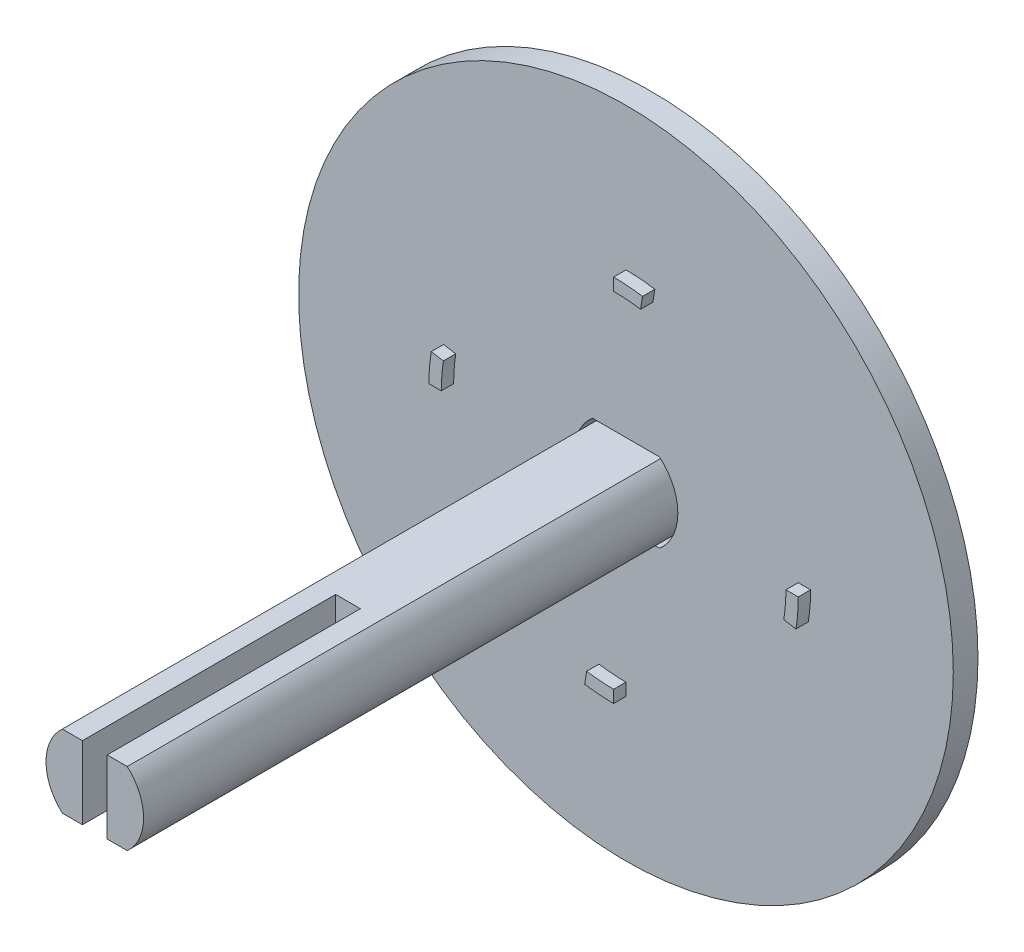
ISO-10303-21;
HEADER;
FILE_DESCRIPTION(('STEP AP214'),'2;1');
FILE_NAME('part.step','',(''),(''),'','','');
FILE_SCHEMA(('AUTOMOTIVE_DESIGN { 1 0 10303 214 1 1 1 1 }'));
ENDSEC;
DATA;
#1=APPLICATION_CONTEXT('core data for automotive mechanical design processes');
#2=APPLICATION_PROTOCOL_DEFINITION('international standard','automotive_design',2000,#1);
#3=PRODUCT_CONTEXT('',#1,'mechanical');
#4=PRODUCT('Part','Part','',(#3));
#5=PRODUCT_RELATED_PRODUCT_CATEGORY('part','',(#4));
#6=PRODUCT_DEFINITION_FORMATION('','',#4);
#7=PRODUCT_DEFINITION_CONTEXT('part definition',#1,'design');
#8=PRODUCT_DEFINITION('design','',#6,#7);
#9=PRODUCT_DEFINITION_SHAPE('','',#8);
#10=(LENGTH_UNIT() NAMED_UNIT(*) SI_UNIT(.MILLI.,.METRE.));
#11=(NAMED_UNIT(*) PLANE_ANGLE_UNIT() SI_UNIT($,.RADIAN.));
#12=(NAMED_UNIT(*) SI_UNIT($,.STERADIAN.) SOLID_ANGLE_UNIT());
#13=UNCERTAINTY_MEASURE_WITH_UNIT(LENGTH_MEASURE(1.E-05),#10,'distance_accuracy_value','');
#14=(GEOMETRIC_REPRESENTATION_CONTEXT(3) GLOBAL_UNCERTAINTY_ASSIGNED_CONTEXT((#13)) GLOBAL_UNIT_ASSIGNED_CONTEXT((#10,
#11,#12)) REPRESENTATION_CONTEXT('',''));
#15=CARTESIAN_POINT('',(0.,0.,0.));
#16=DIRECTION('',(0.,0.,1.));
#17=DIRECTION('',(1.,0.,0.));
#18=AXIS2_PLACEMENT_3D('',#15,#16,#17);
#19=CARTESIAN_POINT('',(0.,0.,45.));
#20=DIRECTION('',(0.,0.,1.));
#21=DIRECTION('',(1.,0.,0.));
#22=AXIS2_PLACEMENT_3D('',#19,#20,#21);
#23=PLANE('',#22);
#24=DIRECTION('',(0.,1.,0.));
#25=VECTOR('',#24,1.);
#26=CARTESIAN_POINT('',(-1.,-2.95,45.));
#27=LINE('',#26,#25);
#28=CARTESIAN_POINT('',(-1.,-2.95,45.));
#29=VERTEX_POINT('',#28);
#30=CARTESIAN_POINT('',(-1.,2.95,45.));
#31=VERTEX_POINT('',#30);
#32=EDGE_CURVE('E140',#29,#31,#27,.T.);
#33=ORIENTED_EDGE('',*,*,#32,.T.);
#34=DIRECTION('',(-1.,0.,0.));
#35=VECTOR('',#34,1.);
#36=CARTESIAN_POINT('',(-2.62678510731274,2.95,45.));
#37=LINE('',#36,#35);
#38=CARTESIAN_POINT('',(-2.62678510731274,2.95,45.));
#39=VERTEX_POINT('',#38);
#40=EDGE_CURVE('E154',#31,#39,#37,.T.);
#41=ORIENTED_EDGE('',*,*,#40,.T.);
#42=CARTESIAN_POINT('',(0.,0.,45.));
#43=DIRECTION('',(0.,0.,1.));
#44=DIRECTION('',(1.,0.,0.));
#45=AXIS2_PLACEMENT_3D('',#42,#43,#44);
#46=CIRCLE('',#45,3.95);
#47=CARTESIAN_POINT('',(-2.62678510731274,-2.95,45.));
#48=VERTEX_POINT('',#47);
#49=EDGE_CURVE('E143',#39,#48,#46,.T.);
#50=ORIENTED_EDGE('',*,*,#49,.T.);
#51=DIRECTION('',(1.,0.,0.));
#52=VECTOR('',#51,1.);
#53=CARTESIAN_POINT('',(-2.62678510731274,-2.95,45.));
#54=LINE('',#53,#52);
#55=EDGE_CURVE('E148',#48,#29,#54,.T.);
#56=ORIENTED_EDGE('',*,*,#55,.T.);
#57=EDGE_LOOP('',(#33,#41,#50,#56));
#58=FACE_BOUND('',#57,.T.);
#59=ADVANCED_FACE('F44',(#58),#23,.T.);
#60=CARTESIAN_POINT('',(0.,0.,0.));
#61=DIRECTION('',(0.,0.,1.));
#62=DIRECTION('',(1.,0.,0.));
#63=AXIS2_PLACEMENT_3D('',#60,#61,#62);
#64=CYLINDRICAL_SURFACE('',#63,3.95);
#65=DIRECTION('',(0.,0.,1.));
#66=VECTOR('',#65,1.);
#67=CARTESIAN_POINT('',(-2.62678510731274,-2.95,0.));
#68=LINE('',#67,#66);
#69=CARTESIAN_POINT('',(-2.62678510731274,-2.95,0.));
#70=VERTEX_POINT('',#69);
#71=EDGE_CURVE('E48',#70,#48,#68,.T.);
#72=ORIENTED_EDGE('',*,*,#71,.T.);
#73=ORIENTED_EDGE('',*,*,#49,.F.);
#74=DIRECTION('',(0.,0.,1.));
#75=VECTOR('',#74,1.);
#76=CARTESIAN_POINT('',(-2.62678510731274,2.95,0.));
#77=LINE('',#76,#75);
#78=CARTESIAN_POINT('',(-2.62678510731274,2.95,0.));
#79=VERTEX_POINT('',#78);
#80=EDGE_CURVE('E12',#79,#39,#77,.T.);
#81=ORIENTED_EDGE('',*,*,#80,.F.);
#82=CARTESIAN_POINT('',(0.,0.,0.));
#83=DIRECTION('',(0.,0.,1.));
#84=DIRECTION('',(1.,0.,0.));
#85=AXIS2_PLACEMENT_3D('',#82,#83,#84);
#86=CIRCLE('',#85,3.95);
#87=EDGE_CURVE('E158',#79,#70,#86,.T.);
#88=ORIENTED_EDGE('',*,*,#87,.T.);
#89=EDGE_LOOP('',(#72,#73,#81,#88));
#90=FACE_BOUND('',#89,.T.);
#91=ADVANCED_FACE('F46',(#90),#64,.T.);
#92=CARTESIAN_POINT('',(-2.62678510731274,2.95,0.));
#93=DIRECTION('',(0.,1.,0.));
#94=DIRECTION('',(-1.,0.,0.));
#95=AXIS2_PLACEMENT_3D('',#92,#93,#94);
#96=PLANE('',#95);
#97=DIRECTION('',(0.,0.,1.));
#98=VECTOR('',#97,1.);
#99=CARTESIAN_POINT('',(-1.,2.95,24.5));
#100=LINE('',#99,#98);
#101=CARTESIAN_POINT('',(-1.,2.95,24.5));
#102=VERTEX_POINT('',#101);
#103=EDGE_CURVE('E132',#102,#31,#100,.T.);
#104=ORIENTED_EDGE('',*,*,#103,.F.);
#105=DIRECTION('',(-1.,0.,0.));
#106=VECTOR('',#105,1.);
#107=CARTESIAN_POINT('',(-1.,2.95,24.5));
#108=LINE('',#107,#106);
#109=CARTESIAN_POINT('',(0.999999999999997,2.95,24.5));
#110=VERTEX_POINT('',#109);
#111=EDGE_CURVE('E134',#110,#102,#108,.T.);
#112=ORIENTED_EDGE('',*,*,#111,.F.);
#113=DIRECTION('',(0.,0.,-1.));
#114=VECTOR('',#113,1.);
#115=CARTESIAN_POINT('',(1.,2.95,45.));
#116=LINE('',#115,#114);
#117=CARTESIAN_POINT('',(1.,2.95,45.));
#118=VERTEX_POINT('',#117);
#119=EDGE_CURVE('E113',#118,#110,#116,.T.);
#120=ORIENTED_EDGE('',*,*,#119,.F.);
#121=CARTESIAN_POINT('',(2.62678510731274,2.95,45.));
#122=VERTEX_POINT('',#121);
#123=EDGE_CURVE('E155',#122,#118,#37,.T.);
#124=ORIENTED_EDGE('',*,*,#123,.F.);
#125=DIRECTION('',(0.,0.,1.));
#126=VECTOR('',#125,1.);
#127=CARTESIAN_POINT('',(2.62678510731274,2.95,0.));
#128=LINE('',#127,#126);
#129=CARTESIAN_POINT('',(2.62678510731274,2.95,0.));
#130=VERTEX_POINT('',#129);
#131=EDGE_CURVE('E53',#130,#122,#128,.T.);
#132=ORIENTED_EDGE('',*,*,#131,.F.);
#133=DIRECTION('',(-1.,0.,0.));
#134=VECTOR('',#133,1.);
#135=CARTESIAN_POINT('',(-2.62678510731274,2.95,0.));
#136=LINE('',#135,#134);
#137=EDGE_CURVE('E166',#130,#79,#136,.T.);
#138=ORIENTED_EDGE('',*,*,#137,.T.);
#139=ORIENTED_EDGE('',*,*,#80,.T.);
#140=ORIENTED_EDGE('',*,*,#40,.F.);
#141=EDGE_LOOP('',(#104,#112,#120,#124,#132,#138,#139,#140));
#142=FACE_BOUND('',#141,.T.);
#143=ADVANCED_FACE('F177',(#142),#96,.T.);
#144=CARTESIAN_POINT('',(0.,0.,0.));
#145=DIRECTION('',(0.,0.,1.));
#146=DIRECTION('',(1.,0.,0.));
#147=AXIS2_PLACEMENT_3D('',#144,#145,#146);
#148=CYLINDRICAL_SURFACE('',#147,3.95);
#149=ORIENTED_EDGE('',*,*,#131,.T.);
#150=CARTESIAN_POINT('',(0.,0.,45.));
#151=DIRECTION('',(0.,0.,1.));
#152=DIRECTION('',(1.,0.,0.));
#153=AXIS2_PLACEMENT_3D('',#150,#151,#152);
#154=CIRCLE('',#153,3.95);
#155=CARTESIAN_POINT('',(2.62678510731274,-2.95,45.));
#156=VERTEX_POINT('',#155);
#157=EDGE_CURVE('E151',#156,#122,#154,.T.);
#158=ORIENTED_EDGE('',*,*,#157,.F.);
#159=DIRECTION('',(0.,0.,1.));
#160=VECTOR('',#159,1.);
#161=CARTESIAN_POINT('',(2.62678510731274,-2.95,0.));
#162=LINE('',#161,#160);
#163=CARTESIAN_POINT('',(2.62678510731274,-2.95,0.));
#164=VERTEX_POINT('',#163);
#165=EDGE_CURVE('E169',#164,#156,#162,.T.);
#166=ORIENTED_EDGE('',*,*,#165,.F.);
#167=CARTESIAN_POINT('',(0.,0.,0.));
#168=DIRECTION('',(0.,0.,1.));
#169=DIRECTION('',(1.,0.,0.));
#170=AXIS2_PLACEMENT_3D('',#167,#168,#169);
#171=CIRCLE('',#170,3.95);
#172=EDGE_CURVE('E163',#164,#130,#171,.T.);
#173=ORIENTED_EDGE('',*,*,#172,.T.);
#174=EDGE_LOOP('',(#149,#158,#166,#173));
#175=FACE_BOUND('',#174,.T.);
#176=ADVANCED_FACE('F184',(#175),#148,.T.);
#177=CARTESIAN_POINT('',(-2.62678510731274,-2.95,0.));
#178=DIRECTION('',(0.,-1.,0.));
#179=DIRECTION('',(1.,0.,0.));
#180=AXIS2_PLACEMENT_3D('',#177,#178,#179);
#181=PLANE('',#180);
#182=DIRECTION('',(0.,0.,1.));
#183=VECTOR('',#182,1.);
#184=CARTESIAN_POINT('',(-1.,-2.95,24.5));
#185=LINE('',#184,#183);
#186=CARTESIAN_POINT('',(-1.,-2.95,24.5));
#187=VERTEX_POINT('',#186);
#188=EDGE_CURVE('E126',#187,#29,#185,.T.);
#189=ORIENTED_EDGE('',*,*,#188,.T.);
#190=ORIENTED_EDGE('',*,*,#55,.F.);
#191=ORIENTED_EDGE('',*,*,#71,.F.);
#192=DIRECTION('',(1.,0.,0.));
#193=VECTOR('',#192,1.);
#194=CARTESIAN_POINT('',(-2.62678510731274,-2.95,0.));
#195=LINE('',#194,#193);
#196=EDGE_CURVE('E160',#70,#164,#195,.T.);
#197=ORIENTED_EDGE('',*,*,#196,.T.);
#198=ORIENTED_EDGE('',*,*,#165,.T.);
#199=CARTESIAN_POINT('',(1.,-2.95,45.));
#200=VERTEX_POINT('',#199);
#201=EDGE_CURVE('E131',#200,#156,#54,.T.);
#202=ORIENTED_EDGE('',*,*,#201,.F.);
#203=DIRECTION('',(0.,0.,-1.));
#204=VECTOR('',#203,1.);
#205=CARTESIAN_POINT('',(1.,-2.95,45.));
#206=LINE('',#205,#204);
#207=CARTESIAN_POINT('',(0.999999999999997,-2.95,24.5));
#208=VERTEX_POINT('',#207);
#209=EDGE_CURVE('E61',#200,#208,#206,.T.);
#210=ORIENTED_EDGE('',*,*,#209,.T.);
#211=DIRECTION('',(-1.,0.,0.));
#212=VECTOR('',#211,1.);
#213=CARTESIAN_POINT('',(-1.,-2.95,24.5));
#214=LINE('',#213,#212);
#215=EDGE_CURVE('E121',#208,#187,#214,.T.);
#216=ORIENTED_EDGE('',*,*,#215,.T.);
#217=EDGE_LOOP('',(#189,#190,#191,#197,#198,#202,#210,#216));
#218=FACE_BOUND('',#217,.T.);
#219=ADVANCED_FACE('F129',(#218),#181,.T.);
#220=CARTESIAN_POINT('',(0.,0.,0.));
#221=DIRECTION('',(0.,0.,1.));
#222=DIRECTION('',(1.,0.,0.));
#223=AXIS2_PLACEMENT_3D('',#220,#221,#222);
#224=PLANE('',#223);
#225=ORIENTED_EDGE('',*,*,#87,.F.);
#226=ORIENTED_EDGE('',*,*,#137,.F.);
#227=ORIENTED_EDGE('',*,*,#172,.F.);
#228=ORIENTED_EDGE('',*,*,#196,.F.);
#229=EDGE_LOOP('',(#225,#226,#227,#228));
#230=FACE_BOUND('',#229,.T.);
#231=ADVANCED_FACE('F182',(#230),#224,.F.);
#232=DIRECTION('',(0.,1.,0.));
#233=VECTOR('',#232,1.);
#234=CARTESIAN_POINT('',(1.,-2.95,45.));
#235=LINE('',#234,#233);
#236=EDGE_CURVE('E118',#200,#118,#235,.T.);
#237=ORIENTED_EDGE('',*,*,#236,.F.);
#238=ORIENTED_EDGE('',*,*,#201,.T.);
#239=ORIENTED_EDGE('',*,*,#157,.T.);
#240=ORIENTED_EDGE('',*,*,#123,.T.);
#241=EDGE_LOOP('',(#237,#238,#239,#240));
#242=FACE_BOUND('',#241,.T.);
#243=ADVANCED_FACE('F186',(#242),#23,.T.);
#244=CARTESIAN_POINT('',(-1.,-2.95,24.5));
#245=DIRECTION('',(-1.,0.,0.));
#246=DIRECTION('',(0.,0.,1.));
#247=AXIS2_PLACEMENT_3D('',#244,#245,#246);
#248=PLANE('',#247);
#249=ORIENTED_EDGE('',*,*,#103,.T.);
#250=ORIENTED_EDGE('',*,*,#32,.F.);
#251=ORIENTED_EDGE('',*,*,#188,.F.);
#252=DIRECTION('',(0.,1.,0.));
#253=VECTOR('',#252,1.);
#254=CARTESIAN_POINT('',(-1.,-2.95,24.5));
#255=LINE('',#254,#253);
#256=EDGE_CURVE('E117',#187,#102,#255,.T.);
#257=ORIENTED_EDGE('',*,*,#256,.T.);
#258=EDGE_LOOP('',(#249,#250,#251,#257));
#259=FACE_BOUND('',#258,.T.);
#260=ADVANCED_FACE('F188',(#259),#248,.F.);
#261=CARTESIAN_POINT('',(-1.,-2.95,24.5));
#262=DIRECTION('',(0.,0.,-1.));
#263=DIRECTION('',(-1.,0.,0.));
#264=AXIS2_PLACEMENT_3D('',#261,#262,#263);
#265=PLANE('',#264);
#266=ORIENTED_EDGE('',*,*,#111,.T.);
#267=ORIENTED_EDGE('',*,*,#256,.F.);
#268=ORIENTED_EDGE('',*,*,#215,.F.);
#269=DIRECTION('',(0.,1.,0.));
#270=VECTOR('',#269,1.);
#271=CARTESIAN_POINT('',(0.999999999999997,-2.95,24.5));
#272=LINE('',#271,#270);
#273=EDGE_CURVE('E109',#208,#110,#272,.T.);
#274=ORIENTED_EDGE('',*,*,#273,.T.);
#275=EDGE_LOOP('',(#266,#267,#268,#274));
#276=FACE_BOUND('',#275,.T.);
#277=ADVANCED_FACE('F122',(#276),#265,.F.);
#278=CARTESIAN_POINT('',(1.,-2.95,45.));
#279=DIRECTION('',(1.,0.,0.));
#280=DIRECTION('',(0.,0.,-1.));
#281=AXIS2_PLACEMENT_3D('',#278,#279,#280);
#282=PLANE('',#281);
#283=ORIENTED_EDGE('',*,*,#119,.T.);
#284=ORIENTED_EDGE('',*,*,#273,.F.);
#285=ORIENTED_EDGE('',*,*,#209,.F.);
#286=ORIENTED_EDGE('',*,*,#236,.T.);
#287=EDGE_LOOP('',(#283,#284,#285,#286));
#288=FACE_BOUND('',#287,.T.);
#289=ADVANCED_FACE('F111',(#288),#282,.F.);
#290=CLOSED_SHELL('',(#59,#91,#143,#176,#219,#231,#243,#260,#277,#289));
#291=MANIFOLD_SOLID_BREP('B2_NOT_SHOWN',#290);
#292=CARTESIAN_POINT('',(0.,0.,2.));
#293=DIRECTION('',(0.,0.,1.));
#294=DIRECTION('',(1.,0.,0.));
#295=AXIS2_PLACEMENT_3D('',#292,#293,#294);
#296=PLANE('',#295);
#297=CARTESIAN_POINT('',(0.,0.,2.));
#298=DIRECTION('',(0.,0.,1.));
#299=DIRECTION('',(1.,0.,0.));
#300=AXIS2_PLACEMENT_3D('',#297,#298,#299);
#301=CIRCLE('',#300,4.2);
#302=CARTESIAN_POINT('',(2.72029410174709,-3.2,2.));
#303=VERTEX_POINT('',#302);
#304=CARTESIAN_POINT('',(2.72029410174709,3.2,2.));
#305=VERTEX_POINT('',#304);
#306=EDGE_CURVE('E419',#303,#305,#301,.T.);
#307=ORIENTED_EDGE('',*,*,#306,.F.);
#308=DIRECTION('',(1.,0.,0.));
#309=VECTOR('',#308,1.);
#310=CARTESIAN_POINT('',(0.,-3.2,2.));
#311=LINE('',#310,#309);
#312=CARTESIAN_POINT('',(-2.72029410174709,-3.2,2.));
#313=VERTEX_POINT('',#312);
#314=EDGE_CURVE('E412',#313,#303,#311,.T.);
#315=ORIENTED_EDGE('',*,*,#314,.F.);
#316=CARTESIAN_POINT('',(0.,0.,2.));
#317=DIRECTION('',(0.,0.,1.));
#318=DIRECTION('',(1.,0.,0.));
#319=AXIS2_PLACEMENT_3D('',#316,#317,#318);
#320=CIRCLE('',#319,4.2);
#321=CARTESIAN_POINT('',(-2.72029410174709,3.2,2.));
#322=VERTEX_POINT('',#321);
#323=EDGE_CURVE('E392',#322,#313,#320,.T.);
#324=ORIENTED_EDGE('',*,*,#323,.F.);
#325=DIRECTION('',(-1.,0.,0.));
#326=VECTOR('',#325,1.);
#327=CARTESIAN_POINT('',(0.,3.2,2.));
#328=LINE('',#327,#326);
#329=EDGE_CURVE('E417',#305,#322,#328,.T.);
#330=ORIENTED_EDGE('',*,*,#329,.F.);
#331=EDGE_LOOP('',(#307,#315,#324,#330));
#332=FACE_BOUND('',#331,.T.);
#333=DIRECTION('',(0.,1.,0.));
#334=VECTOR('',#333,1.);
#335=CARTESIAN_POINT('',(0.,-13.95,2.));
#336=LINE('',#335,#334);
#337=CARTESIAN_POINT('',(-1.04828972900404E-13,-14.95,2.));
#338=VERTEX_POINT('',#337);
#339=CARTESIAN_POINT('',(0.,-13.95,2.));
#340=VERTEX_POINT('',#339);
#341=EDGE_CURVE('E464',#338,#340,#336,.T.);
#342=ORIENTED_EDGE('',*,*,#341,.F.);
#343=CARTESIAN_POINT('',(0.,0.,2.));
#344=DIRECTION('',(0.,0.,1.));
#345=DIRECTION('',(1.,0.,0.));
#346=AXIS2_PLACEMENT_3D('',#343,#344,#345);
#347=CIRCLE('',#346,14.95);
#348=CARTESIAN_POINT('',(-2.33869525235156,-14.7659406918973,2.));
#349=VERTEX_POINT('',#348);
#350=EDGE_CURVE('E450',#349,#338,#347,.T.);
#351=ORIENTED_EDGE('',*,*,#350,.F.);
#352=DIRECTION('',(-0.156434465040238,-0.987688340595137,0.));
#353=VECTOR('',#352,1.);
#354=CARTESIAN_POINT('',(-2.18226078731132,-13.7782523513022,2.));
#355=LINE('',#354,#353);
#356=CARTESIAN_POINT('',(-2.18226078731132,-13.7782523513022,2.));
#357=VERTEX_POINT('',#356);
#358=EDGE_CURVE('E455',#357,#349,#355,.T.);
#359=ORIENTED_EDGE('',*,*,#358,.F.);
#360=CARTESIAN_POINT('',(0.,0.,2.));
#361=DIRECTION('',(0.,0.,-1.));
#362=DIRECTION('',(1.,0.,0.));
#363=AXIS2_PLACEMENT_3D('',#360,#361,#362);
#364=CIRCLE('',#363,13.95);
#365=EDGE_CURVE('E466',#340,#357,#364,.T.);
#366=ORIENTED_EDGE('',*,*,#365,.F.);
#367=EDGE_LOOP('',(#342,#351,#359,#366));
#368=FACE_BOUND('',#367,.T.);
#369=DIRECTION('',(0.,-1.,0.));
#370=VECTOR('',#369,1.);
#371=CARTESIAN_POINT('',(0.,13.95,2.));
#372=LINE('',#371,#370);
#373=CARTESIAN_POINT('',(0.,14.95,2.));
#374=VERTEX_POINT('',#373);
#375=CARTESIAN_POINT('',(0.,13.95,2.));
#376=VERTEX_POINT('',#375);
#377=EDGE_CURVE('E522',#374,#376,#372,.T.);
#378=ORIENTED_EDGE('',*,*,#377,.F.);
#379=CARTESIAN_POINT('',(0.,0.,2.));
#380=DIRECTION('',(0.,0.,1.));
#381=DIRECTION('',(1.,0.,0.));
#382=AXIS2_PLACEMENT_3D('',#379,#380,#381);
#383=CIRCLE('',#382,14.95);
#384=CARTESIAN_POINT('',(2.33869525235146,14.7659406918973,2.));
#385=VERTEX_POINT('',#384);
#386=EDGE_CURVE('E508',#385,#374,#383,.T.);
#387=ORIENTED_EDGE('',*,*,#386,.F.);
#388=DIRECTION('',(0.156434465040231,0.987688340595138,0.));
#389=VECTOR('',#388,1.);
#390=CARTESIAN_POINT('',(2.18226078731123,13.7782523513022,2.));
#391=LINE('',#390,#389);
#392=CARTESIAN_POINT('',(2.18226078731123,13.7782523513022,2.));
#393=VERTEX_POINT('',#392);
#394=EDGE_CURVE('E513',#393,#385,#391,.T.);
#395=ORIENTED_EDGE('',*,*,#394,.F.);
#396=CARTESIAN_POINT('',(0.,0.,2.));
#397=DIRECTION('',(0.,0.,-1.));
#398=DIRECTION('',(1.,0.,0.));
#399=AXIS2_PLACEMENT_3D('',#396,#397,#398);
#400=CIRCLE('',#399,13.95);
#401=EDGE_CURVE('E524',#376,#393,#400,.T.);
#402=ORIENTED_EDGE('',*,*,#401,.F.);
#403=EDGE_LOOP('',(#378,#387,#395,#402));
#404=FACE_BOUND('',#403,.T.);
#405=CARTESIAN_POINT('',(0.,0.,2.));
#406=DIRECTION('',(0.,0.,1.));
#407=DIRECTION('',(1.,0.,0.));
#408=AXIS2_PLACEMENT_3D('',#405,#406,#407);
#409=CIRCLE('',#408,26.5);
#410=CARTESIAN_POINT('',(26.5,0.,2.));
#411=VERTEX_POINT('',#410);
#412=EDGE_CURVE('E42',#411,#411,#409,.T.);
#413=ORIENTED_EDGE('',*,*,#412,.T.);
#414=EDGE_LOOP('',(#413));
#415=FACE_BOUND('',#414,.T.);
#416=DIRECTION('',(-1.,0.,0.));
#417=VECTOR('',#416,1.);
#418=CARTESIAN_POINT('',(13.95,0.,2.));
#419=LINE('',#418,#417);
#420=CARTESIAN_POINT('',(14.95,0.,2.));
#421=VERTEX_POINT('',#420);
#422=CARTESIAN_POINT('',(13.95,0.,2.));
#423=VERTEX_POINT('',#422);
#424=EDGE_CURVE('E493',#421,#423,#419,.T.);
#425=ORIENTED_EDGE('',*,*,#424,.F.);
#426=CARTESIAN_POINT('',(0.,0.,2.));
#427=DIRECTION('',(0.,0.,1.));
#428=DIRECTION('',(1.,0.,0.));
#429=AXIS2_PLACEMENT_3D('',#426,#427,#428);
#430=CIRCLE('',#429,14.95);
#431=CARTESIAN_POINT('',(14.7659406918973,-2.33869525235151,2.));
#432=VERTEX_POINT('',#431);
#433=EDGE_CURVE('E479',#432,#421,#430,.T.);
#434=ORIENTED_EDGE('',*,*,#433,.F.);
#435=DIRECTION('',(0.987688340595137,-0.156434465040235,0.));
#436=VECTOR('',#435,1.);
#437=CARTESIAN_POINT('',(13.7782523513022,-2.18226078731127,2.));
#438=LINE('',#437,#436);
#439=CARTESIAN_POINT('',(13.7782523513022,-2.18226078731127,2.));
#440=VERTEX_POINT('',#439);
#441=EDGE_CURVE('E484',#440,#432,#438,.T.);
#442=ORIENTED_EDGE('',*,*,#441,.F.);
#443=CARTESIAN_POINT('',(0.,0.,2.));
#444=DIRECTION('',(0.,0.,-1.));
#445=DIRECTION('',(1.,0.,0.));
#446=AXIS2_PLACEMENT_3D('',#443,#444,#445);
#447=CIRCLE('',#446,13.95);
#448=EDGE_CURVE('E495',#423,#440,#447,.T.);
#449=ORIENTED_EDGE('',*,*,#448,.F.);
#450=EDGE_LOOP('',(#425,#434,#442,#449));
#451=FACE_BOUND('',#450,.T.);
#452=DIRECTION('',(1.,0.,0.));
#453=VECTOR('',#452,1.);
#454=CARTESIAN_POINT('',(-13.95,1.46118494030585E-13,2.));
#455=LINE('',#454,#453);
#456=CARTESIAN_POINT('',(-14.95,1.56592938047115E-13,2.));
#457=VERTEX_POINT('',#456);
#458=CARTESIAN_POINT('',(-13.95,1.46118494030585E-13,2.));
#459=VERTEX_POINT('',#458);
#460=EDGE_CURVE('E435',#457,#459,#455,.T.);
#461=ORIENTED_EDGE('',*,*,#460,.F.);
#462=CARTESIAN_POINT('',(0.,0.,2.));
#463=DIRECTION('',(0.,0.,1.));
#464=DIRECTION('',(1.,0.,0.));
#465=AXIS2_PLACEMENT_3D('',#462,#463,#464);
#466=CIRCLE('',#465,14.95);
#467=CARTESIAN_POINT('',(-14.7659406918973,2.33869525235161,2.));
#468=VERTEX_POINT('',#467);
#469=EDGE_CURVE('E421',#468,#457,#466,.T.);
#470=ORIENTED_EDGE('',*,*,#469,.F.);
#471=DIRECTION('',(-0.987688340595136,0.156434465040241,0.));
#472=VECTOR('',#471,1.);
#473=CARTESIAN_POINT('',(-13.7782523513022,2.18226078731137,2.));
#474=LINE('',#473,#472);
#475=CARTESIAN_POINT('',(-13.7782523513022,2.18226078731137,2.));
#476=VERTEX_POINT('',#475);
#477=EDGE_CURVE('E426',#476,#468,#474,.T.);
#478=ORIENTED_EDGE('',*,*,#477,.F.);
#479=CARTESIAN_POINT('',(0.,0.,2.));
#480=DIRECTION('',(0.,0.,-1.));
#481=DIRECTION('',(1.,0.,0.));
#482=AXIS2_PLACEMENT_3D('',#479,#480,#481);
#483=CIRCLE('',#482,13.95);
#484=EDGE_CURVE('E437',#459,#476,#483,.T.);
#485=ORIENTED_EDGE('',*,*,#484,.F.);
#486=EDGE_LOOP('',(#461,#470,#478,#485));
#487=FACE_BOUND('',#486,.T.);
#488=ADVANCED_FACE('F249',(#332,#368,#404,#415,#451,#487),#296,.T.);
#489=CARTESIAN_POINT('',(0.,0.,2.));
#490=DIRECTION('',(0.,0.,-1.));
#491=DIRECTION('',(-1.,0.,0.));
#492=AXIS2_PLACEMENT_3D('',#489,#490,#491);
#493=CYLINDRICAL_SURFACE('',#492,26.5);
#494=ORIENTED_EDGE('',*,*,#412,.F.);
#495=EDGE_LOOP('',(#494));
#496=FACE_BOUND('',#495,.T.);
#497=CARTESIAN_POINT('',(0.,0.,0.));
#498=DIRECTION('',(0.,0.,1.));
#499=DIRECTION('',(1.,0.,0.));
#500=AXIS2_PLACEMENT_3D('',#497,#498,#499);
#501=CIRCLE('',#500,26.5);
#502=CARTESIAN_POINT('',(26.5,0.,0.));
#503=VERTEX_POINT('',#502);
#504=EDGE_CURVE('E253',#503,#503,#501,.T.);
#505=ORIENTED_EDGE('',*,*,#504,.T.);
#506=EDGE_LOOP('',(#505));
#507=FACE_BOUND('',#506,.T.);
#508=ADVANCED_FACE('F251',(#496,#507),#493,.T.);
#509=CARTESIAN_POINT('',(0.,0.,0.));
#510=DIRECTION('',(0.,0.,1.));
#511=DIRECTION('',(1.,0.,0.));
#512=AXIS2_PLACEMENT_3D('',#509,#510,#511);
#513=PLANE('',#512);
#514=DIRECTION('',(-1.,0.,0.));
#515=VECTOR('',#514,1.);
#516=CARTESIAN_POINT('',(-2.72029410174709,-3.2,0.));
#517=LINE('',#516,#515);
#518=CARTESIAN_POINT('',(2.72029410174709,-3.2,0.));
#519=VERTEX_POINT('',#518);
#520=CARTESIAN_POINT('',(-2.72029410174709,-3.2,0.));
#521=VERTEX_POINT('',#520);
#522=EDGE_CURVE('E398',#519,#521,#517,.T.);
#523=ORIENTED_EDGE('',*,*,#522,.F.);
#524=CARTESIAN_POINT('',(0.,0.,0.));
#525=DIRECTION('',(0.,0.,-1.));
#526=DIRECTION('',(-1.,0.,0.));
#527=AXIS2_PLACEMENT_3D('',#524,#525,#526);
#528=CIRCLE('',#527,4.2);
#529=CARTESIAN_POINT('',(2.72029410174709,3.2,0.));
#530=VERTEX_POINT('',#529);
#531=EDGE_CURVE('E272',#530,#519,#528,.T.);
#532=ORIENTED_EDGE('',*,*,#531,.F.);
#533=DIRECTION('',(1.,0.,0.));
#534=VECTOR('',#533,1.);
#535=CARTESIAN_POINT('',(2.72029410174709,3.2,0.));
#536=LINE('',#535,#534);
#537=CARTESIAN_POINT('',(-2.72029410174709,3.2,0.));
#538=VERTEX_POINT('',#537);
#539=EDGE_CURVE('E405',#538,#530,#536,.T.);
#540=ORIENTED_EDGE('',*,*,#539,.F.);
#541=CARTESIAN_POINT('',(0.,0.,0.));
#542=DIRECTION('',(0.,0.,-1.));
#543=DIRECTION('',(-1.,0.,0.));
#544=AXIS2_PLACEMENT_3D('',#541,#542,#543);
#545=CIRCLE('',#544,4.2);
#546=EDGE_CURVE('E389',#521,#538,#545,.T.);
#547=ORIENTED_EDGE('',*,*,#546,.F.);
#548=EDGE_LOOP('',(#523,#532,#540,#547));
#549=FACE_BOUND('',#548,.T.);
#550=ORIENTED_EDGE('',*,*,#504,.F.);
#551=EDGE_LOOP('',(#550));
#552=FACE_BOUND('',#551,.T.);
#553=ADVANCED_FACE('F402',(#549,#552),#513,.F.);
#554=CARTESIAN_POINT('',(0.,0.,3.));
#555=DIRECTION('',(0.,0.,-1.));
#556=DIRECTION('',(-1.,0.,0.));
#557=AXIS2_PLACEMENT_3D('',#554,#555,#556);
#558=CYLINDRICAL_SURFACE('',#557,14.95);
#559=ORIENTED_EDGE('',*,*,#386,.T.);
#560=DIRECTION('',(0.,0.,-1.));
#561=VECTOR('',#560,1.);
#562=CARTESIAN_POINT('',(0.,14.95,3.));
#563=LINE('',#562,#561);
#564=CARTESIAN_POINT('',(0.,14.95,3.));
#565=VERTEX_POINT('',#564);
#566=EDGE_CURVE('E535',#565,#374,#563,.T.);
#567=ORIENTED_EDGE('',*,*,#566,.F.);
#568=CARTESIAN_POINT('',(0.,0.,3.));
#569=DIRECTION('',(0.,0.,1.));
#570=DIRECTION('',(1.,0.,0.));
#571=AXIS2_PLACEMENT_3D('',#568,#569,#570);
#572=CIRCLE('',#571,14.95);
#573=CARTESIAN_POINT('',(2.33869525235146,14.7659406918973,3.));
#574=VERTEX_POINT('',#573);
#575=EDGE_CURVE('E509',#574,#565,#572,.T.);
#576=ORIENTED_EDGE('',*,*,#575,.F.);
#577=DIRECTION('',(0.,0.,-1.));
#578=VECTOR('',#577,1.);
#579=CARTESIAN_POINT('',(2.33869525235146,14.7659406918973,3.));
#580=LINE('',#579,#578);
#581=EDGE_CURVE('E519',#574,#385,#580,.T.);
#582=ORIENTED_EDGE('',*,*,#581,.T.);
#583=EDGE_LOOP('',(#559,#567,#576,#582));
#584=FACE_BOUND('',#583,.T.);
#585=ADVANCED_FACE('F542',(#584),#558,.T.);
#586=CARTESIAN_POINT('',(0.,13.95,3.));
#587=DIRECTION('',(1.,0.,0.));
#588=DIRECTION('',(0.,0.,-1.));
#589=AXIS2_PLACEMENT_3D('',#586,#587,#588);
#590=PLANE('',#589);
#591=ORIENTED_EDGE('',*,*,#377,.T.);
#592=DIRECTION('',(0.,0.,-1.));
#593=VECTOR('',#592,1.);
#594=CARTESIAN_POINT('',(0.,13.95,3.));
#595=LINE('',#594,#593);
#596=CARTESIAN_POINT('',(0.,13.95,3.));
#597=VERTEX_POINT('',#596);
#598=EDGE_CURVE('E532',#597,#376,#595,.T.);
#599=ORIENTED_EDGE('',*,*,#598,.F.);
#600=DIRECTION('',(0.,-1.,0.));
#601=VECTOR('',#600,1.);
#602=CARTESIAN_POINT('',(0.,13.95,3.));
#603=LINE('',#602,#601);
#604=EDGE_CURVE('E512',#565,#597,#603,.T.);
#605=ORIENTED_EDGE('',*,*,#604,.F.);
#606=ORIENTED_EDGE('',*,*,#566,.T.);
#607=EDGE_LOOP('',(#591,#599,#605,#606));
#608=FACE_BOUND('',#607,.T.);
#609=ADVANCED_FACE('F547',(#608),#590,.F.);
#610=CARTESIAN_POINT('',(0.,0.,3.));
#611=DIRECTION('',(0.,0.,-1.));
#612=DIRECTION('',(-1.,0.,0.));
#613=AXIS2_PLACEMENT_3D('',#610,#611,#612);
#614=CYLINDRICAL_SURFACE('',#613,13.95);
#615=ORIENTED_EDGE('',*,*,#401,.T.);
#616=DIRECTION('',(0.,0.,-1.));
#617=VECTOR('',#616,1.);
#618=CARTESIAN_POINT('',(2.18226078731122,13.7782523513022,3.));
#619=LINE('',#618,#617);
#620=CARTESIAN_POINT('',(2.18226078731122,13.7782523513022,3.));
#621=VERTEX_POINT('',#620);
#622=EDGE_CURVE('E530',#621,#393,#619,.T.);
#623=ORIENTED_EDGE('',*,*,#622,.F.);
#624=CARTESIAN_POINT('',(0.,0.,3.));
#625=DIRECTION('',(0.,0.,-1.));
#626=DIRECTION('',(1.,0.,0.));
#627=AXIS2_PLACEMENT_3D('',#624,#625,#626);
#628=CIRCLE('',#627,13.95);
#629=EDGE_CURVE('E515',#597,#621,#628,.T.);
#630=ORIENTED_EDGE('',*,*,#629,.F.);
#631=ORIENTED_EDGE('',*,*,#598,.T.);
#632=EDGE_LOOP('',(#615,#623,#630,#631));
#633=FACE_BOUND('',#632,.T.);
#634=ADVANCED_FACE('F561',(#633),#614,.F.);
#635=CARTESIAN_POINT('',(2.18226078731123,13.7782523513022,3.));
#636=DIRECTION('',(-0.987688340595138,0.156434465040231,0.));
#637=DIRECTION('',(-0.156434465040231,-0.987688340595138,0.));
#638=AXIS2_PLACEMENT_3D('',#635,#636,#637);
#639=PLANE('',#638);
#640=ORIENTED_EDGE('',*,*,#394,.T.);
#641=ORIENTED_EDGE('',*,*,#581,.F.);
#642=DIRECTION('',(0.156434465040231,0.987688340595138,0.));
#643=VECTOR('',#642,1.);
#644=CARTESIAN_POINT('',(2.18226078731123,13.7782523513022,3.));
#645=LINE('',#644,#643);
#646=EDGE_CURVE('E517',#621,#574,#645,.T.);
#647=ORIENTED_EDGE('',*,*,#646,.F.);
#648=ORIENTED_EDGE('',*,*,#622,.T.);
#649=EDGE_LOOP('',(#640,#641,#647,#648));
#650=FACE_BOUND('',#649,.T.);
#651=ADVANCED_FACE('F564',(#650),#639,.F.);
#652=CARTESIAN_POINT('',(0.,0.,3.));
#653=DIRECTION('',(0.,0.,1.));
#654=DIRECTION('',(1.,0.,0.));
#655=AXIS2_PLACEMENT_3D('',#652,#653,#654);
#656=PLANE('',#655);
#657=ORIENTED_EDGE('',*,*,#575,.T.);
#658=ORIENTED_EDGE('',*,*,#604,.T.);
#659=ORIENTED_EDGE('',*,*,#629,.T.);
#660=ORIENTED_EDGE('',*,*,#646,.T.);
#661=EDGE_LOOP('',(#657,#658,#659,#660));
#662=FACE_BOUND('',#661,.T.);
#663=ADVANCED_FACE('F568',(#662),#656,.T.);
#664=CARTESIAN_POINT('',(0.,0.,3.));
#665=DIRECTION('',(0.,0.,-1.));
#666=DIRECTION('',(-1.,0.,0.));
#667=AXIS2_PLACEMENT_3D('',#664,#665,#666);
#668=CYLINDRICAL_SURFACE('',#667,14.95);
#669=ORIENTED_EDGE('',*,*,#433,.T.);
#670=DIRECTION('',(0.,0.,-1.));
#671=VECTOR('',#670,1.);
#672=CARTESIAN_POINT('',(14.95,0.,3.));
#673=LINE('',#672,#671);
#674=CARTESIAN_POINT('',(14.95,0.,3.));
#675=VERTEX_POINT('',#674);
#676=EDGE_CURVE('E506',#675,#421,#673,.T.);
#677=ORIENTED_EDGE('',*,*,#676,.F.);
#678=CARTESIAN_POINT('',(0.,0.,3.));
#679=DIRECTION('',(0.,0.,1.));
#680=DIRECTION('',(1.,0.,0.));
#681=AXIS2_PLACEMENT_3D('',#678,#679,#680);
#682=CIRCLE('',#681,14.95);
#683=CARTESIAN_POINT('',(14.7659406918973,-2.33869525235151,3.));
#684=VERTEX_POINT('',#683);
#685=EDGE_CURVE('E480',#684,#675,#682,.T.);
#686=ORIENTED_EDGE('',*,*,#685,.F.);
#687=DIRECTION('',(0.,0.,-1.));
#688=VECTOR('',#687,1.);
#689=CARTESIAN_POINT('',(14.7659406918973,-2.33869525235151,3.));
#690=LINE('',#689,#688);
#691=EDGE_CURVE('E490',#684,#432,#690,.T.);
#692=ORIENTED_EDGE('',*,*,#691,.T.);
#693=EDGE_LOOP('',(#669,#677,#686,#692));
#694=FACE_BOUND('',#693,.T.);
#695=ADVANCED_FACE('F572',(#694),#668,.T.);
#696=CARTESIAN_POINT('',(13.95,0.,3.));
#697=DIRECTION('',(0.,-1.,0.));
#698=DIRECTION('',(1.,0.,0.));
#699=AXIS2_PLACEMENT_3D('',#696,#697,#698);
#700=PLANE('',#699);
#701=ORIENTED_EDGE('',*,*,#424,.T.);
#702=DIRECTION('',(0.,0.,-1.));
#703=VECTOR('',#702,1.);
#704=CARTESIAN_POINT('',(13.95,0.,3.));
#705=LINE('',#704,#703);
#706=CARTESIAN_POINT('',(13.95,0.,3.));
#707=VERTEX_POINT('',#706);
#708=EDGE_CURVE('E503',#707,#423,#705,.T.);
#709=ORIENTED_EDGE('',*,*,#708,.F.);
#710=DIRECTION('',(-1.,0.,0.));
#711=VECTOR('',#710,1.);
#712=CARTESIAN_POINT('',(13.95,0.,3.));
#713=LINE('',#712,#711);
#714=EDGE_CURVE('E483',#675,#707,#713,.T.);
#715=ORIENTED_EDGE('',*,*,#714,.F.);
#716=ORIENTED_EDGE('',*,*,#676,.T.);
#717=EDGE_LOOP('',(#701,#709,#715,#716));
#718=FACE_BOUND('',#717,.T.);
#719=ADVANCED_FACE('F576',(#718),#700,.F.);
#720=CARTESIAN_POINT('',(0.,0.,3.));
#721=DIRECTION('',(0.,0.,-1.));
#722=DIRECTION('',(-1.,0.,0.));
#723=AXIS2_PLACEMENT_3D('',#720,#721,#722);
#724=CYLINDRICAL_SURFACE('',#723,13.95);
#725=ORIENTED_EDGE('',*,*,#448,.T.);
#726=DIRECTION('',(0.,0.,-1.));
#727=VECTOR('',#726,1.);
#728=CARTESIAN_POINT('',(13.7782523513022,-2.18226078731127,3.));
#729=LINE('',#728,#727);
#730=CARTESIAN_POINT('',(13.7782523513022,-2.18226078731127,3.));
#731=VERTEX_POINT('',#730);
#732=EDGE_CURVE('E501',#731,#440,#729,.T.);
#733=ORIENTED_EDGE('',*,*,#732,.F.);
#734=CARTESIAN_POINT('',(0.,0.,3.));
#735=DIRECTION('',(0.,0.,-1.));
#736=DIRECTION('',(1.,0.,0.));
#737=AXIS2_PLACEMENT_3D('',#734,#735,#736);
#738=CIRCLE('',#737,13.95);
#739=EDGE_CURVE('E486',#707,#731,#738,.T.);
#740=ORIENTED_EDGE('',*,*,#739,.F.);
#741=ORIENTED_EDGE('',*,*,#708,.T.);
#742=EDGE_LOOP('',(#725,#733,#740,#741));
#743=FACE_BOUND('',#742,.T.);
#744=ADVANCED_FACE('F580',(#743),#724,.F.);
#745=CARTESIAN_POINT('',(13.7782523513022,-2.18226078731127,3.));
#746=DIRECTION('',(0.156434465040235,0.987688340595137,0.));
#747=DIRECTION('',(-0.987688340595137,0.156434465040235,0.));
#748=AXIS2_PLACEMENT_3D('',#745,#746,#747);
#749=PLANE('',#748);
#750=ORIENTED_EDGE('',*,*,#441,.T.);
#751=ORIENTED_EDGE('',*,*,#691,.F.);
#752=DIRECTION('',(0.987688340595137,-0.156434465040235,0.));
#753=VECTOR('',#752,1.);
#754=CARTESIAN_POINT('',(13.7782523513022,-2.18226078731127,3.));
#755=LINE('',#754,#753);
#756=EDGE_CURVE('E488',#731,#684,#755,.T.);
#757=ORIENTED_EDGE('',*,*,#756,.F.);
#758=ORIENTED_EDGE('',*,*,#732,.T.);
#759=EDGE_LOOP('',(#750,#751,#757,#758));
#760=FACE_BOUND('',#759,.T.);
#761=ADVANCED_FACE('F584',(#760),#749,.F.);
#762=CARTESIAN_POINT('',(0.,0.,3.));
#763=DIRECTION('',(0.,0.,1.));
#764=DIRECTION('',(1.,0.,0.));
#765=AXIS2_PLACEMENT_3D('',#762,#763,#764);
#766=PLANE('',#765);
#767=ORIENTED_EDGE('',*,*,#685,.T.);
#768=ORIENTED_EDGE('',*,*,#714,.T.);
#769=ORIENTED_EDGE('',*,*,#739,.T.);
#770=ORIENTED_EDGE('',*,*,#756,.T.);
#771=EDGE_LOOP('',(#767,#768,#769,#770));
#772=FACE_BOUND('',#771,.T.);
#773=ADVANCED_FACE('F588',(#772),#766,.T.);
#774=CARTESIAN_POINT('',(0.,0.,3.));
#775=DIRECTION('',(0.,0.,-1.));
#776=DIRECTION('',(-1.,0.,0.));
#777=AXIS2_PLACEMENT_3D('',#774,#775,#776);
#778=CYLINDRICAL_SURFACE('',#777,14.95);
#779=ORIENTED_EDGE('',*,*,#350,.T.);
#780=DIRECTION('',(0.,0.,-1.));
#781=VECTOR('',#780,1.);
#782=CARTESIAN_POINT('',(-1.04828972900404E-13,-14.95,3.));
#783=LINE('',#782,#781);
#784=CARTESIAN_POINT('',(-1.04828972900404E-13,-14.95,3.));
#785=VERTEX_POINT('',#784);
#786=EDGE_CURVE('E477',#785,#338,#783,.T.);
#787=ORIENTED_EDGE('',*,*,#786,.F.);
#788=CARTESIAN_POINT('',(0.,0.,3.));
#789=DIRECTION('',(0.,0.,1.));
#790=DIRECTION('',(1.,0.,0.));
#791=AXIS2_PLACEMENT_3D('',#788,#789,#790);
#792=CIRCLE('',#791,14.95);
#793=CARTESIAN_POINT('',(-2.33869525235156,-14.7659406918973,3.));
#794=VERTEX_POINT('',#793);
#795=EDGE_CURVE('E451',#794,#785,#792,.T.);
#796=ORIENTED_EDGE('',*,*,#795,.F.);
#797=DIRECTION('',(0.,0.,-1.));
#798=VECTOR('',#797,1.);
#799=CARTESIAN_POINT('',(-2.33869525235156,-14.7659406918973,3.));
#800=LINE('',#799,#798);
#801=EDGE_CURVE('E461',#794,#349,#800,.T.);
#802=ORIENTED_EDGE('',*,*,#801,.T.);
#803=EDGE_LOOP('',(#779,#787,#796,#802));
#804=FACE_BOUND('',#803,.T.);
#805=ADVANCED_FACE('F592',(#804),#778,.T.);
#806=CARTESIAN_POINT('',(0.,-13.95,3.));
#807=DIRECTION('',(-1.,0.,0.));
#808=DIRECTION('',(0.,-1.,0.));
#809=AXIS2_PLACEMENT_3D('',#806,#807,#808);
#810=PLANE('',#809);
#811=ORIENTED_EDGE('',*,*,#341,.T.);
#812=DIRECTION('',(0.,0.,-1.));
#813=VECTOR('',#812,1.);
#814=CARTESIAN_POINT('',(0.,-13.95,3.));
#815=LINE('',#814,#813);
#816=CARTESIAN_POINT('',(0.,-13.95,3.));
#817=VERTEX_POINT('',#816);
#818=EDGE_CURVE('E474',#817,#340,#815,.T.);
#819=ORIENTED_EDGE('',*,*,#818,.F.);
#820=DIRECTION('',(0.,1.,0.));
#821=VECTOR('',#820,1.);
#822=CARTESIAN_POINT('',(0.,-13.95,3.));
#823=LINE('',#822,#821);
#824=EDGE_CURVE('E454',#785,#817,#823,.T.);
#825=ORIENTED_EDGE('',*,*,#824,.F.);
#826=ORIENTED_EDGE('',*,*,#786,.T.);
#827=EDGE_LOOP('',(#811,#819,#825,#826));
#828=FACE_BOUND('',#827,.T.);
#829=ADVANCED_FACE('F596',(#828),#810,.F.);
#830=CARTESIAN_POINT('',(0.,0.,3.));
#831=DIRECTION('',(0.,0.,-1.));
#832=DIRECTION('',(-1.,0.,0.));
#833=AXIS2_PLACEMENT_3D('',#830,#831,#832);
#834=CYLINDRICAL_SURFACE('',#833,13.95);
#835=ORIENTED_EDGE('',*,*,#365,.T.);
#836=DIRECTION('',(0.,0.,-1.));
#837=VECTOR('',#836,1.);
#838=CARTESIAN_POINT('',(-2.18226078731132,-13.7782523513022,3.));
#839=LINE('',#838,#837);
#840=CARTESIAN_POINT('',(-2.18226078731132,-13.7782523513022,3.));
#841=VERTEX_POINT('',#840);
#842=EDGE_CURVE('E472',#841,#357,#839,.T.);
#843=ORIENTED_EDGE('',*,*,#842,.F.);
#844=CARTESIAN_POINT('',(0.,0.,3.));
#845=DIRECTION('',(0.,0.,-1.));
#846=DIRECTION('',(1.,0.,0.));
#847=AXIS2_PLACEMENT_3D('',#844,#845,#846);
#848=CIRCLE('',#847,13.95);
#849=EDGE_CURVE('E457',#817,#841,#848,.T.);
#850=ORIENTED_EDGE('',*,*,#849,.F.);
#851=ORIENTED_EDGE('',*,*,#818,.T.);
#852=EDGE_LOOP('',(#835,#843,#850,#851));
#853=FACE_BOUND('',#852,.T.);
#854=ADVANCED_FACE('F600',(#853),#834,.F.);
#855=CARTESIAN_POINT('',(-2.18226078731132,-13.7782523513022,3.));
#856=DIRECTION('',(0.987688340595137,-0.156434465040238,0.));
#857=DIRECTION('',(0.156434465040238,0.987688340595137,0.));
#858=AXIS2_PLACEMENT_3D('',#855,#856,#857);
#859=PLANE('',#858);
#860=ORIENTED_EDGE('',*,*,#358,.T.);
#861=ORIENTED_EDGE('',*,*,#801,.F.);
#862=DIRECTION('',(-0.156434465040238,-0.987688340595137,0.));
#863=VECTOR('',#862,1.);
#864=CARTESIAN_POINT('',(-2.18226078731132,-13.7782523513022,3.));
#865=LINE('',#864,#863);
#866=EDGE_CURVE('E459',#841,#794,#865,.T.);
#867=ORIENTED_EDGE('',*,*,#866,.F.);
#868=ORIENTED_EDGE('',*,*,#842,.T.);
#869=EDGE_LOOP('',(#860,#861,#867,#868));
#870=FACE_BOUND('',#869,.T.);
#871=ADVANCED_FACE('F604',(#870),#859,.F.);
#872=CARTESIAN_POINT('',(0.,0.,3.));
#873=DIRECTION('',(0.,0.,1.));
#874=DIRECTION('',(1.,0.,0.));
#875=AXIS2_PLACEMENT_3D('',#872,#873,#874);
#876=PLANE('',#875);
#877=ORIENTED_EDGE('',*,*,#795,.T.);
#878=ORIENTED_EDGE('',*,*,#824,.T.);
#879=ORIENTED_EDGE('',*,*,#849,.T.);
#880=ORIENTED_EDGE('',*,*,#866,.T.);
#881=EDGE_LOOP('',(#877,#878,#879,#880));
#882=FACE_BOUND('',#881,.T.);
#883=ADVANCED_FACE('F608',(#882),#876,.T.);
#884=CARTESIAN_POINT('',(0.,0.,3.));
#885=DIRECTION('',(0.,0.,-1.));
#886=DIRECTION('',(-1.,0.,0.));
#887=AXIS2_PLACEMENT_3D('',#884,#885,#886);
#888=CYLINDRICAL_SURFACE('',#887,14.95);
#889=ORIENTED_EDGE('',*,*,#469,.T.);
#890=DIRECTION('',(0.,0.,-1.));
#891=VECTOR('',#890,1.);
#892=CARTESIAN_POINT('',(-14.95,1.56592938047115E-13,3.));
#893=LINE('',#892,#891);
#894=CARTESIAN_POINT('',(-14.95,1.56592938047115E-13,3.));
#895=VERTEX_POINT('',#894);
#896=EDGE_CURVE('E448',#895,#457,#893,.T.);
#897=ORIENTED_EDGE('',*,*,#896,.F.);
#898=CARTESIAN_POINT('',(0.,0.,3.));
#899=DIRECTION('',(0.,0.,1.));
#900=DIRECTION('',(1.,0.,0.));
#901=AXIS2_PLACEMENT_3D('',#898,#899,#900);
#902=CIRCLE('',#901,14.95);
#903=CARTESIAN_POINT('',(-14.7659406918973,2.33869525235161,3.));
#904=VERTEX_POINT('',#903);
#905=EDGE_CURVE('E422',#904,#895,#902,.T.);
#906=ORIENTED_EDGE('',*,*,#905,.F.);
#907=DIRECTION('',(0.,0.,-1.));
#908=VECTOR('',#907,1.);
#909=CARTESIAN_POINT('',(-14.7659406918973,2.33869525235161,3.));
#910=LINE('',#909,#908);
#911=EDGE_CURVE('E432',#904,#468,#910,.T.);
#912=ORIENTED_EDGE('',*,*,#911,.T.);
#913=EDGE_LOOP('',(#889,#897,#906,#912));
#914=FACE_BOUND('',#913,.T.);
#915=ADVANCED_FACE('F612',(#914),#888,.T.);
#916=CARTESIAN_POINT('',(-13.95,1.46118494030585E-13,3.));
#917=DIRECTION('',(0.,1.,0.));
#918=DIRECTION('',(-1.,0.,0.));
#919=AXIS2_PLACEMENT_3D('',#916,#917,#918);
#920=PLANE('',#919);
#921=ORIENTED_EDGE('',*,*,#460,.T.);
#922=DIRECTION('',(0.,0.,-1.));
#923=VECTOR('',#922,1.);
#924=CARTESIAN_POINT('',(-13.95,1.46118494030585E-13,3.));
#925=LINE('',#924,#923);
#926=CARTESIAN_POINT('',(-13.95,1.46118494030585E-13,3.));
#927=VERTEX_POINT('',#926);
#928=EDGE_CURVE('E445',#927,#459,#925,.T.);
#929=ORIENTED_EDGE('',*,*,#928,.F.);
#930=DIRECTION('',(1.,0.,0.));
#931=VECTOR('',#930,1.);
#932=CARTESIAN_POINT('',(-13.95,1.46118494030585E-13,3.));
#933=LINE('',#932,#931);
#934=EDGE_CURVE('E425',#895,#927,#933,.T.);
#935=ORIENTED_EDGE('',*,*,#934,.F.);
#936=ORIENTED_EDGE('',*,*,#896,.T.);
#937=EDGE_LOOP('',(#921,#929,#935,#936));
#938=FACE_BOUND('',#937,.T.);
#939=ADVANCED_FACE('F616',(#938),#920,.F.);
#940=CARTESIAN_POINT('',(0.,0.,3.));
#941=DIRECTION('',(0.,0.,-1.));
#942=DIRECTION('',(-1.,0.,0.));
#943=AXIS2_PLACEMENT_3D('',#940,#941,#942);
#944=CYLINDRICAL_SURFACE('',#943,13.95);
#945=ORIENTED_EDGE('',*,*,#484,.T.);
#946=DIRECTION('',(0.,0.,-1.));
#947=VECTOR('',#946,1.);
#948=CARTESIAN_POINT('',(-13.7782523513022,2.18226078731137,3.));
#949=LINE('',#948,#947);
#950=CARTESIAN_POINT('',(-13.7782523513022,2.18226078731137,3.));
#951=VERTEX_POINT('',#950);
#952=EDGE_CURVE('E443',#951,#476,#949,.T.);
#953=ORIENTED_EDGE('',*,*,#952,.F.);
#954=CARTESIAN_POINT('',(0.,0.,3.));
#955=DIRECTION('',(0.,0.,-1.));
#956=DIRECTION('',(1.,0.,0.));
#957=AXIS2_PLACEMENT_3D('',#954,#955,#956);
#958=CIRCLE('',#957,13.95);
#959=EDGE_CURVE('E428',#927,#951,#958,.T.);
#960=ORIENTED_EDGE('',*,*,#959,.F.);
#961=ORIENTED_EDGE('',*,*,#928,.T.);
#962=EDGE_LOOP('',(#945,#953,#960,#961));
#963=FACE_BOUND('',#962,.T.);
#964=ADVANCED_FACE('F620',(#963),#944,.F.);
#965=CARTESIAN_POINT('',(-13.7782523513022,2.18226078731137,3.));
#966=DIRECTION('',(-0.156434465040241,-0.987688340595136,0.));
#967=DIRECTION('',(0.987688340595136,-0.156434465040241,0.));
#968=AXIS2_PLACEMENT_3D('',#965,#966,#967);
#969=PLANE('',#968);
#970=ORIENTED_EDGE('',*,*,#477,.T.);
#971=ORIENTED_EDGE('',*,*,#911,.F.);
#972=DIRECTION('',(-0.987688340595136,0.156434465040241,0.));
#973=VECTOR('',#972,1.);
#974=CARTESIAN_POINT('',(-13.7782523513022,2.18226078731137,3.));
#975=LINE('',#974,#973);
#976=EDGE_CURVE('E430',#951,#904,#975,.T.);
#977=ORIENTED_EDGE('',*,*,#976,.F.);
#978=ORIENTED_EDGE('',*,*,#952,.T.);
#979=EDGE_LOOP('',(#970,#971,#977,#978));
#980=FACE_BOUND('',#979,.T.);
#981=ADVANCED_FACE('F624',(#980),#969,.F.);
#982=CARTESIAN_POINT('',(0.,0.,3.));
#983=DIRECTION('',(0.,0.,1.));
#984=DIRECTION('',(1.,0.,0.));
#985=AXIS2_PLACEMENT_3D('',#982,#983,#984);
#986=PLANE('',#985);
#987=ORIENTED_EDGE('',*,*,#905,.T.);
#988=ORIENTED_EDGE('',*,*,#934,.T.);
#989=ORIENTED_EDGE('',*,*,#959,.T.);
#990=ORIENTED_EDGE('',*,*,#976,.T.);
#991=EDGE_LOOP('',(#987,#988,#989,#990));
#992=FACE_BOUND('',#991,.T.);
#993=ADVANCED_FACE('F628',(#992),#986,.T.);
#994=CARTESIAN_POINT('',(0.,0.,10.));
#995=DIRECTION('',(0.,0.,-1.));
#996=DIRECTION('',(-1.,0.,0.));
#997=AXIS2_PLACEMENT_3D('',#994,#995,#996);
#998=CYLINDRICAL_SURFACE('',#997,4.2);
#999=ORIENTED_EDGE('',*,*,#306,.T.);
#1000=DIRECTION('',(0.,0.,-1.));
#1001=VECTOR('',#1000,1.);
#1002=CARTESIAN_POINT('',(2.72029410174709,3.2,10.));
#1003=LINE('',#1002,#1001);
#1004=EDGE_CURVE('E410',#305,#530,#1003,.T.);
#1005=ORIENTED_EDGE('',*,*,#1004,.T.);
#1006=ORIENTED_EDGE('',*,*,#531,.T.);
#1007=DIRECTION('',(0.,0.,-1.));
#1008=VECTOR('',#1007,1.);
#1009=CARTESIAN_POINT('',(2.72029410174709,-3.2,10.));
#1010=LINE('',#1009,#1008);
#1011=EDGE_CURVE('E395',#303,#519,#1010,.T.);
#1012=ORIENTED_EDGE('',*,*,#1011,.F.);
#1013=EDGE_LOOP('',(#999,#1005,#1006,#1012));
#1014=FACE_BOUND('',#1013,.T.);
#1015=ADVANCED_FACE('F632',(#1014),#998,.F.);
#1016=CARTESIAN_POINT('',(2.72029410174709,3.2,10.));
#1017=DIRECTION('',(0.,1.,0.));
#1018=DIRECTION('',(0.,0.,1.));
#1019=AXIS2_PLACEMENT_3D('',#1016,#1017,#1018);
#1020=PLANE('',#1019);
#1021=ORIENTED_EDGE('',*,*,#329,.T.);
#1022=DIRECTION('',(0.,0.,-1.));
#1023=VECTOR('',#1022,1.);
#1024=CARTESIAN_POINT('',(-2.72029410174709,3.2,10.));
#1025=LINE('',#1024,#1023);
#1026=EDGE_CURVE('E394',#322,#538,#1025,.T.);
#1027=ORIENTED_EDGE('',*,*,#1026,.T.);
#1028=ORIENTED_EDGE('',*,*,#539,.T.);
#1029=ORIENTED_EDGE('',*,*,#1004,.F.);
#1030=EDGE_LOOP('',(#1021,#1027,#1028,#1029));
#1031=FACE_BOUND('',#1030,.T.);
#1032=ADVANCED_FACE('F636',(#1031),#1020,.F.);
#1033=CARTESIAN_POINT('',(0.,0.,10.));
#1034=DIRECTION('',(0.,0.,-1.));
#1035=DIRECTION('',(-1.,0.,0.));
#1036=AXIS2_PLACEMENT_3D('',#1033,#1034,#1035);
#1037=CYLINDRICAL_SURFACE('',#1036,4.2);
#1038=ORIENTED_EDGE('',*,*,#323,.T.);
#1039=DIRECTION('',(0.,0.,-1.));
#1040=VECTOR('',#1039,1.);
#1041=CARTESIAN_POINT('',(-2.72029410174709,-3.2,10.));
#1042=LINE('',#1041,#1040);
#1043=EDGE_CURVE('E264',#313,#521,#1042,.T.);
#1044=ORIENTED_EDGE('',*,*,#1043,.T.);
#1045=ORIENTED_EDGE('',*,*,#546,.T.);
#1046=ORIENTED_EDGE('',*,*,#1026,.F.);
#1047=EDGE_LOOP('',(#1038,#1044,#1045,#1046));
#1048=FACE_BOUND('',#1047,.T.);
#1049=ADVANCED_FACE('F386',(#1048),#1037,.F.);
#1050=CARTESIAN_POINT('',(-2.72029410174709,-3.2,10.));
#1051=DIRECTION('',(0.,-1.,0.));
#1052=DIRECTION('',(0.,0.,-1.));
#1053=AXIS2_PLACEMENT_3D('',#1050,#1051,#1052);
#1054=PLANE('',#1053);
#1055=ORIENTED_EDGE('',*,*,#314,.T.);
#1056=ORIENTED_EDGE('',*,*,#1011,.T.);
#1057=ORIENTED_EDGE('',*,*,#522,.T.);
#1058=ORIENTED_EDGE('',*,*,#1043,.F.);
#1059=EDGE_LOOP('',(#1055,#1056,#1057,#1058));
#1060=FACE_BOUND('',#1059,.T.);
#1061=ADVANCED_FACE('F399',(#1060),#1054,.F.);
#1062=CLOSED_SHELL('',(#488,#508,#553,#585,#609,#634,#651,#663,#695,#719,#744,#761,#773,#805,
#829,#854,#871,#883,#915,#939,#964,#981,#993,#1015,#1032,#1049,#1061));
#1063=MANIFOLD_SOLID_BREP('B6',#1062);
#1064=ADVANCED_BREP_SHAPE_REPRESENTATION('',(#18,#291,#1063),#14);
#1065=SHAPE_DEFINITION_REPRESENTATION(#9,#1064);
ENDSEC;
END-ISO-10303-21;
